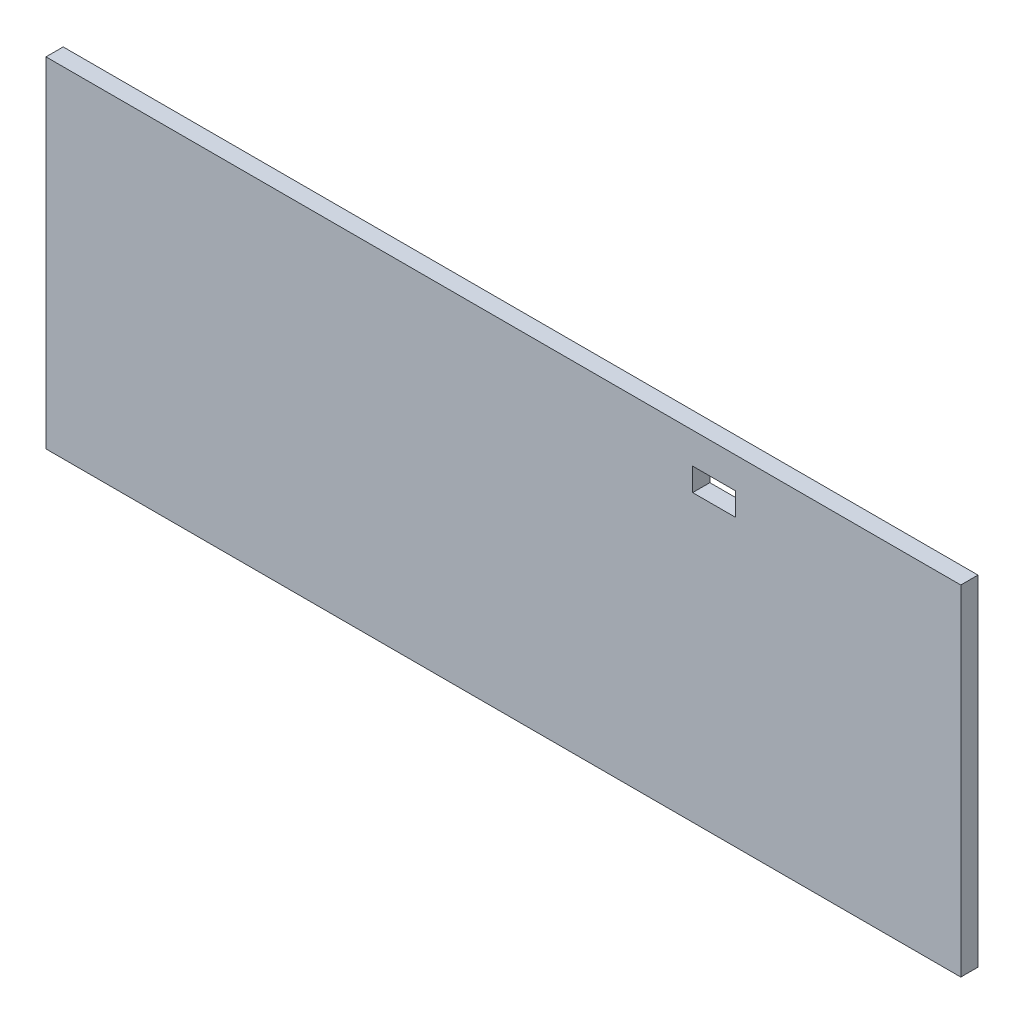
ISO-10303-21;
HEADER;
FILE_DESCRIPTION(('STEP AP214'),'2;1');
FILE_NAME('part.step','',(''),(''),'','','');
FILE_SCHEMA(('AUTOMOTIVE_DESIGN { 1 0 10303 214 1 1 1 1 }'));
ENDSEC;
DATA;
#1=APPLICATION_CONTEXT('core data for automotive mechanical design processes');
#2=APPLICATION_PROTOCOL_DEFINITION('international standard','automotive_design',2000,#1);
#3=PRODUCT_CONTEXT('',#1,'mechanical');
#4=PRODUCT('Part','Part','',(#3));
#5=PRODUCT_RELATED_PRODUCT_CATEGORY('part','',(#4));
#6=PRODUCT_DEFINITION_FORMATION('','',#4);
#7=PRODUCT_DEFINITION_CONTEXT('part definition',#1,'design');
#8=PRODUCT_DEFINITION('design','',#6,#7);
#9=PRODUCT_DEFINITION_SHAPE('','',#8);
#10=(LENGTH_UNIT() NAMED_UNIT(*) SI_UNIT(.MILLI.,.METRE.));
#11=(NAMED_UNIT(*) PLANE_ANGLE_UNIT() SI_UNIT($,.RADIAN.));
#12=(NAMED_UNIT(*) SI_UNIT($,.STERADIAN.) SOLID_ANGLE_UNIT());
#13=UNCERTAINTY_MEASURE_WITH_UNIT(LENGTH_MEASURE(1.E-05),#10,'distance_accuracy_value','');
#14=(GEOMETRIC_REPRESENTATION_CONTEXT(3) GLOBAL_UNCERTAINTY_ASSIGNED_CONTEXT((#13)) GLOBAL_UNIT_ASSIGNED_CONTEXT((#10,
#11,#12)) REPRESENTATION_CONTEXT('',''));
#15=CARTESIAN_POINT('',(0.,0.,0.));
#16=DIRECTION('',(0.,0.,1.));
#17=DIRECTION('',(1.,0.,0.));
#18=AXIS2_PLACEMENT_3D('',#15,#16,#17);
#19=CARTESIAN_POINT('',(-6.,6.,6.));
#20=DIRECTION('',(1.,0.,0.));
#21=DIRECTION('',(0.,1.,0.));
#22=AXIS2_PLACEMENT_3D('',#19,#20,#21);
#23=PLANE('',#22);
#24=DIRECTION('',(0.,-1.,0.));
#25=VECTOR('',#24,1.);
#26=CARTESIAN_POINT('',(-6.,6.,0.));
#27=LINE('',#26,#25);
#28=CARTESIAN_POINT('',(-6.,6.,0.));
#29=VERTEX_POINT('',#28);
#30=CARTESIAN_POINT('',(-5.99999999999999,-112.414906094222,0.));
#31=VERTEX_POINT('',#30);
#32=EDGE_CURVE('E110',#29,#31,#27,.T.);
#33=ORIENTED_EDGE('',*,*,#32,.T.);
#34=DIRECTION('',(0.,0.,-1.));
#35=VECTOR('',#34,1.);
#36=CARTESIAN_POINT('',(-5.99999999999999,-112.414906094222,6.));
#37=LINE('',#36,#35);
#38=CARTESIAN_POINT('',(-5.99999999999999,-112.414906094222,6.));
#39=VERTEX_POINT('',#38);
#40=EDGE_CURVE('E11',#39,#31,#37,.T.);
#41=ORIENTED_EDGE('',*,*,#40,.F.);
#42=DIRECTION('',(0.,-1.,0.));
#43=VECTOR('',#42,1.);
#44=CARTESIAN_POINT('',(-6.,6.,6.));
#45=LINE('',#44,#43);
#46=CARTESIAN_POINT('',(-6.,6.,6.));
#47=VERTEX_POINT('',#46);
#48=EDGE_CURVE('E133',#47,#39,#45,.T.);
#49=ORIENTED_EDGE('',*,*,#48,.F.);
#50=DIRECTION('',(0.,0.,-1.));
#51=VECTOR('',#50,1.);
#52=CARTESIAN_POINT('',(-6.,6.,6.));
#53=LINE('',#52,#51);
#54=EDGE_CURVE('E143',#47,#29,#53,.T.);
#55=ORIENTED_EDGE('',*,*,#54,.T.);
#56=EDGE_LOOP('',(#33,#41,#49,#55));
#57=FACE_BOUND('',#56,.T.);
#58=ADVANCED_FACE('F32',(#57),#23,.F.);
#59=CARTESIAN_POINT('',(-5.99999999999999,-112.414906094222,6.));
#60=DIRECTION('',(0.,1.,0.));
#61=DIRECTION('',(0.,0.,1.));
#62=AXIS2_PLACEMENT_3D('',#59,#60,#61);
#63=PLANE('',#62);
#64=DIRECTION('',(1.,0.,0.));
#65=VECTOR('',#64,1.);
#66=CARTESIAN_POINT('',(-5.99999999999999,-112.414906094222,0.));
#67=LINE('',#66,#65);
#68=CARTESIAN_POINT('',(313.,-112.414906094222,0.));
#69=VERTEX_POINT('',#68);
#70=EDGE_CURVE('E146',#31,#69,#67,.T.);
#71=ORIENTED_EDGE('',*,*,#70,.T.);
#72=DIRECTION('',(0.,0.,-1.));
#73=VECTOR('',#72,1.);
#74=CARTESIAN_POINT('',(313.,-112.414906094222,6.));
#75=LINE('',#74,#73);
#76=CARTESIAN_POINT('',(313.,-112.414906094222,6.));
#77=VERTEX_POINT('',#76);
#78=EDGE_CURVE('E39',#77,#69,#75,.T.);
#79=ORIENTED_EDGE('',*,*,#78,.F.);
#80=DIRECTION('',(1.,0.,0.));
#81=VECTOR('',#80,1.);
#82=CARTESIAN_POINT('',(-5.99999999999999,-112.414906094222,6.));
#83=LINE('',#82,#81);
#84=EDGE_CURVE('E136',#39,#77,#83,.T.);
#85=ORIENTED_EDGE('',*,*,#84,.F.);
#86=ORIENTED_EDGE('',*,*,#40,.T.);
#87=EDGE_LOOP('',(#71,#79,#85,#86));
#88=FACE_BOUND('',#87,.T.);
#89=ADVANCED_FACE('F174',(#88),#63,.F.);
#90=CARTESIAN_POINT('',(313.,6.,6.));
#91=DIRECTION('',(-1.,0.,0.));
#92=DIRECTION('',(0.,0.,1.));
#93=AXIS2_PLACEMENT_3D('',#90,#91,#92);
#94=PLANE('',#93);
#95=DIRECTION('',(0.,1.,0.));
#96=VECTOR('',#95,1.);
#97=CARTESIAN_POINT('',(313.,6.,0.));
#98=LINE('',#97,#96);
#99=CARTESIAN_POINT('',(313.,6.,0.));
#100=VERTEX_POINT('',#99);
#101=EDGE_CURVE('E148',#69,#100,#98,.T.);
#102=ORIENTED_EDGE('',*,*,#101,.T.);
#103=DIRECTION('',(0.,0.,-1.));
#104=VECTOR('',#103,1.);
#105=CARTESIAN_POINT('',(313.,6.,6.));
#106=LINE('',#105,#104);
#107=CARTESIAN_POINT('',(313.,6.,6.));
#108=VERTEX_POINT('',#107);
#109=EDGE_CURVE('E153',#108,#100,#106,.T.);
#110=ORIENTED_EDGE('',*,*,#109,.F.);
#111=DIRECTION('',(0.,1.,0.));
#112=VECTOR('',#111,1.);
#113=CARTESIAN_POINT('',(313.,6.,6.));
#114=LINE('',#113,#112);
#115=EDGE_CURVE('E139',#77,#108,#114,.T.);
#116=ORIENTED_EDGE('',*,*,#115,.F.);
#117=ORIENTED_EDGE('',*,*,#78,.T.);
#118=EDGE_LOOP('',(#102,#110,#116,#117));
#119=FACE_BOUND('',#118,.T.);
#120=ADVANCED_FACE('F160',(#119),#94,.F.);
#121=CARTESIAN_POINT('',(-6.,6.,6.));
#122=DIRECTION('',(0.,-1.,0.));
#123=DIRECTION('',(0.,0.,-1.));
#124=AXIS2_PLACEMENT_3D('',#121,#122,#123);
#125=PLANE('',#124);
#126=DIRECTION('',(-1.,0.,0.));
#127=VECTOR('',#126,1.);
#128=CARTESIAN_POINT('',(-6.,6.,0.));
#129=LINE('',#128,#127);
#130=EDGE_CURVE('E137',#100,#29,#129,.T.);
#131=ORIENTED_EDGE('',*,*,#130,.T.);
#132=ORIENTED_EDGE('',*,*,#54,.F.);
#133=DIRECTION('',(-1.,0.,0.));
#134=VECTOR('',#133,1.);
#135=CARTESIAN_POINT('',(-6.,6.,6.));
#136=LINE('',#135,#134);
#137=EDGE_CURVE('E141',#108,#47,#136,.T.);
#138=ORIENTED_EDGE('',*,*,#137,.F.);
#139=ORIENTED_EDGE('',*,*,#109,.T.);
#140=EDGE_LOOP('',(#131,#132,#138,#139));
#141=FACE_BOUND('',#140,.T.);
#142=ADVANCED_FACE('F169',(#141),#125,.F.);
#143=CARTESIAN_POINT('',(0.,0.,6.));
#144=DIRECTION('',(0.,0.,1.));
#145=DIRECTION('',(1.,0.,0.));
#146=AXIS2_PLACEMENT_3D('',#143,#144,#145);
#147=PLANE('',#146);
#148=DIRECTION('',(1.,0.,0.));
#149=VECTOR('',#148,1.);
#150=CARTESIAN_POINT('',(219.5,-4.84999999999999,6.));
#151=LINE('',#150,#149);
#152=CARTESIAN_POINT('',(219.5,-4.84999999999999,6.));
#153=VERTEX_POINT('',#152);
#154=CARTESIAN_POINT('',(234.5,-4.84999999999999,6.));
#155=VERTEX_POINT('',#154);
#156=EDGE_CURVE('E98',#153,#155,#151,.T.);
#157=ORIENTED_EDGE('',*,*,#156,.T.);
#158=DIRECTION('',(0.,1.,0.));
#159=VECTOR('',#158,1.);
#160=CARTESIAN_POINT('',(234.5,-12.85,6.));
#161=LINE('',#160,#159);
#162=CARTESIAN_POINT('',(234.5,-12.85,6.));
#163=VERTEX_POINT('',#162);
#164=EDGE_CURVE('E107',#163,#155,#161,.T.);
#165=ORIENTED_EDGE('',*,*,#164,.F.);
#166=DIRECTION('',(1.,0.,0.));
#167=VECTOR('',#166,1.);
#168=CARTESIAN_POINT('',(219.5,-12.85,6.));
#169=LINE('',#168,#167);
#170=CARTESIAN_POINT('',(219.5,-12.85,6.));
#171=VERTEX_POINT('',#170);
#172=EDGE_CURVE('E46',#171,#163,#169,.T.);
#173=ORIENTED_EDGE('',*,*,#172,.F.);
#174=DIRECTION('',(0.,1.,0.));
#175=VECTOR('',#174,1.);
#176=CARTESIAN_POINT('',(219.5,-12.85,6.));
#177=LINE('',#176,#175);
#178=EDGE_CURVE('E116',#171,#153,#177,.T.);
#179=ORIENTED_EDGE('',*,*,#178,.T.);
#180=EDGE_LOOP('',(#157,#165,#173,#179));
#181=FACE_BOUND('',#180,.T.);
#182=ORIENTED_EDGE('',*,*,#48,.T.);
#183=ORIENTED_EDGE('',*,*,#84,.T.);
#184=ORIENTED_EDGE('',*,*,#115,.T.);
#185=ORIENTED_EDGE('',*,*,#137,.T.);
#186=EDGE_LOOP('',(#182,#183,#184,#185));
#187=FACE_BOUND('',#186,.T.);
#188=ADVANCED_FACE('F113',(#181,#187),#147,.T.);
#189=CARTESIAN_POINT('',(0.,0.,0.));
#190=DIRECTION('',(0.,0.,1.));
#191=DIRECTION('',(1.,0.,0.));
#192=AXIS2_PLACEMENT_3D('',#189,#190,#191);
#193=PLANE('',#192);
#194=DIRECTION('',(0.,1.,0.));
#195=VECTOR('',#194,1.);
#196=CARTESIAN_POINT('',(234.5,-12.85,0.));
#197=LINE('',#196,#195);
#198=CARTESIAN_POINT('',(234.5,-12.85,0.));
#199=VERTEX_POINT('',#198);
#200=CARTESIAN_POINT('',(234.5,-4.84999999999999,0.));
#201=VERTEX_POINT('',#200);
#202=EDGE_CURVE('E118',#199,#201,#197,.T.);
#203=ORIENTED_EDGE('',*,*,#202,.T.);
#204=DIRECTION('',(1.,0.,0.));
#205=VECTOR('',#204,1.);
#206=CARTESIAN_POINT('',(219.5,-4.84999999999999,0.));
#207=LINE('',#206,#205);
#208=CARTESIAN_POINT('',(219.5,-4.84999999999999,0.));
#209=VERTEX_POINT('',#208);
#210=EDGE_CURVE('E54',#209,#201,#207,.T.);
#211=ORIENTED_EDGE('',*,*,#210,.F.);
#212=DIRECTION('',(0.,1.,0.));
#213=VECTOR('',#212,1.);
#214=CARTESIAN_POINT('',(219.5,-12.85,0.));
#215=LINE('',#214,#213);
#216=CARTESIAN_POINT('',(219.5,-12.85,0.));
#217=VERTEX_POINT('',#216);
#218=EDGE_CURVE('E104',#217,#209,#215,.T.);
#219=ORIENTED_EDGE('',*,*,#218,.F.);
#220=DIRECTION('',(1.,0.,0.));
#221=VECTOR('',#220,1.);
#222=CARTESIAN_POINT('',(219.5,-12.85,0.));
#223=LINE('',#222,#221);
#224=EDGE_CURVE('E124',#217,#199,#223,.T.);
#225=ORIENTED_EDGE('',*,*,#224,.T.);
#226=EDGE_LOOP('',(#203,#211,#219,#225));
#227=FACE_BOUND('',#226,.T.);
#228=ORIENTED_EDGE('',*,*,#32,.F.);
#229=ORIENTED_EDGE('',*,*,#130,.F.);
#230=ORIENTED_EDGE('',*,*,#101,.F.);
#231=ORIENTED_EDGE('',*,*,#70,.F.);
#232=EDGE_LOOP('',(#228,#229,#230,#231));
#233=FACE_BOUND('',#232,.T.);
#234=ADVANCED_FACE('F166',(#227,#233),#193,.F.);
#235=CARTESIAN_POINT('',(219.5,-4.84999999999999,6.001));
#236=DIRECTION('',(0.,1.,0.));
#237=DIRECTION('',(-1.,0.,0.));
#238=AXIS2_PLACEMENT_3D('',#235,#236,#237);
#239=PLANE('',#238);
#240=DIRECTION('',(0.,0.,-1.));
#241=VECTOR('',#240,1.);
#242=CARTESIAN_POINT('',(219.5,-4.84999999999999,6.001));
#243=LINE('',#242,#241);
#244=EDGE_CURVE('E111',#153,#209,#243,.T.);
#245=ORIENTED_EDGE('',*,*,#244,.T.);
#246=ORIENTED_EDGE('',*,*,#210,.T.);
#247=DIRECTION('',(0.,0.,-1.));
#248=VECTOR('',#247,1.);
#249=CARTESIAN_POINT('',(234.5,-4.84999999999999,6.001));
#250=LINE('',#249,#248);
#251=EDGE_CURVE('E94',#155,#201,#250,.T.);
#252=ORIENTED_EDGE('',*,*,#251,.F.);
#253=ORIENTED_EDGE('',*,*,#156,.F.);
#254=EDGE_LOOP('',(#245,#246,#252,#253));
#255=FACE_BOUND('',#254,.T.);
#256=ADVANCED_FACE('F96',(#255),#239,.F.);
#257=CARTESIAN_POINT('',(219.5,-12.85,6.001));
#258=DIRECTION('',(-1.,0.,0.));
#259=DIRECTION('',(0.,0.,1.));
#260=AXIS2_PLACEMENT_3D('',#257,#258,#259);
#261=PLANE('',#260);
#262=DIRECTION('',(0.,0.,-1.));
#263=VECTOR('',#262,1.);
#264=CARTESIAN_POINT('',(219.5,-12.85,6.001));
#265=LINE('',#264,#263);
#266=EDGE_CURVE('E130',#171,#217,#265,.T.);
#267=ORIENTED_EDGE('',*,*,#266,.T.);
#268=ORIENTED_EDGE('',*,*,#218,.T.);
#269=ORIENTED_EDGE('',*,*,#244,.F.);
#270=ORIENTED_EDGE('',*,*,#178,.F.);
#271=EDGE_LOOP('',(#267,#268,#269,#270));
#272=FACE_BOUND('',#271,.T.);
#273=ADVANCED_FACE('F191',(#272),#261,.F.);
#274=CARTESIAN_POINT('',(219.5,-12.85,6.001));
#275=DIRECTION('',(0.,1.,0.));
#276=DIRECTION('',(0.,0.,1.));
#277=AXIS2_PLACEMENT_3D('',#274,#275,#276);
#278=PLANE('',#277);
#279=ORIENTED_EDGE('',*,*,#172,.T.);
#280=DIRECTION('',(0.,0.,-1.));
#281=VECTOR('',#280,1.);
#282=CARTESIAN_POINT('',(234.5,-12.85,6.001));
#283=LINE('',#282,#281);
#284=EDGE_CURVE('E103',#163,#199,#283,.T.);
#285=ORIENTED_EDGE('',*,*,#284,.T.);
#286=ORIENTED_EDGE('',*,*,#224,.F.);
#287=ORIENTED_EDGE('',*,*,#266,.F.);
#288=EDGE_LOOP('',(#279,#285,#286,#287));
#289=FACE_BOUND('',#288,.T.);
#290=ADVANCED_FACE('F194',(#289),#278,.T.);
#291=CARTESIAN_POINT('',(234.5,-12.85,6.001));
#292=DIRECTION('',(-1.,0.,0.));
#293=DIRECTION('',(0.,0.,1.));
#294=AXIS2_PLACEMENT_3D('',#291,#292,#293);
#295=PLANE('',#294);
#296=ORIENTED_EDGE('',*,*,#164,.T.);
#297=ORIENTED_EDGE('',*,*,#251,.T.);
#298=ORIENTED_EDGE('',*,*,#202,.F.);
#299=ORIENTED_EDGE('',*,*,#284,.F.);
#300=EDGE_LOOP('',(#296,#297,#298,#299));
#301=FACE_BOUND('',#300,.T.);
#302=ADVANCED_FACE('F108',(#301),#295,.T.);
#303=CLOSED_SHELL('',(#58,#89,#120,#142,#188,#234,#256,#273,#290,#302));
#304=MANIFOLD_SOLID_BREP('B2',#303);
#305=ADVANCED_BREP_SHAPE_REPRESENTATION('',(#18,#304),#14);
#306=SHAPE_DEFINITION_REPRESENTATION(#9,#305);
ENDSEC;
END-ISO-10303-21;
